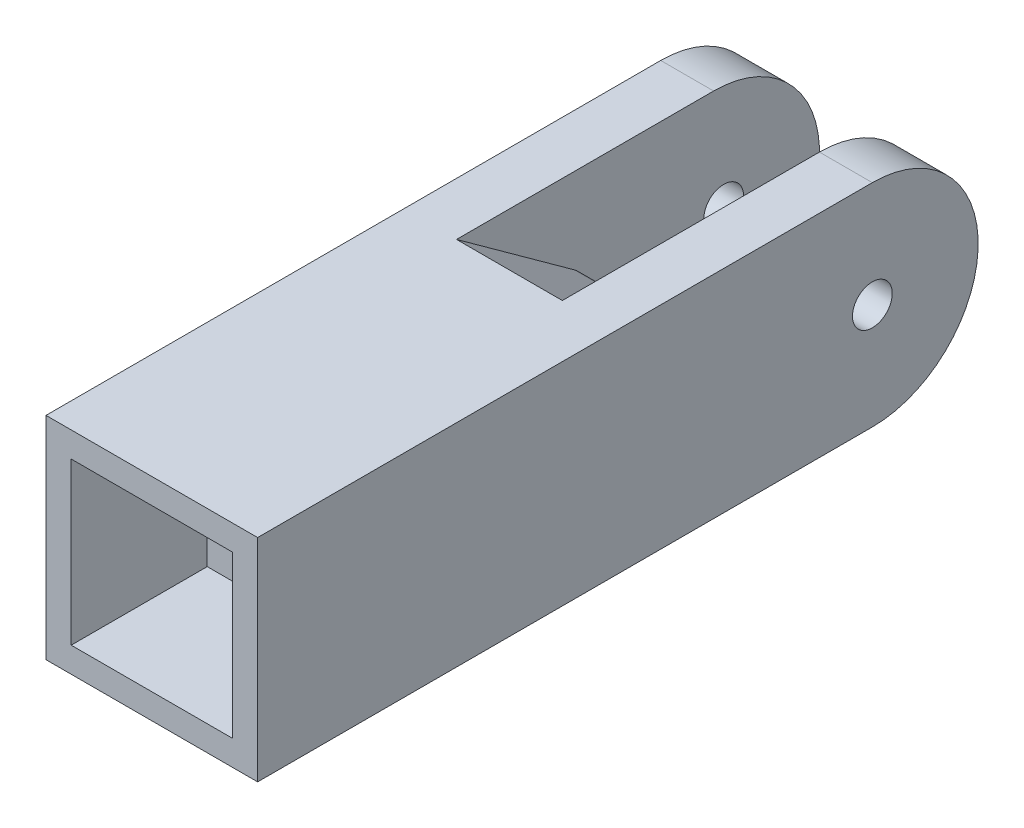
ISO-10303-21;
HEADER;
FILE_DESCRIPTION(('STEP AP214'),'2;1');
FILE_NAME('part.step','',(''),(''),'','','');
FILE_SCHEMA(('AUTOMOTIVE_DESIGN { 1 0 10303 214 1 1 1 1 }'));
ENDSEC;
DATA;
#1=APPLICATION_CONTEXT('core data for automotive mechanical design processes');
#2=APPLICATION_PROTOCOL_DEFINITION('international standard','automotive_design',2000,#1);
#3=PRODUCT_CONTEXT('',#1,'mechanical');
#4=PRODUCT('Part','Part','',(#3));
#5=PRODUCT_RELATED_PRODUCT_CATEGORY('part','',(#4));
#6=PRODUCT_DEFINITION_FORMATION('','',#4);
#7=PRODUCT_DEFINITION_CONTEXT('part definition',#1,'design');
#8=PRODUCT_DEFINITION('design','',#6,#7);
#9=PRODUCT_DEFINITION_SHAPE('','',#8);
#10=(LENGTH_UNIT() NAMED_UNIT(*) SI_UNIT(.MILLI.,.METRE.));
#11=(NAMED_UNIT(*) PLANE_ANGLE_UNIT() SI_UNIT($,.RADIAN.));
#12=(NAMED_UNIT(*) SI_UNIT($,.STERADIAN.) SOLID_ANGLE_UNIT());
#13=UNCERTAINTY_MEASURE_WITH_UNIT(LENGTH_MEASURE(1.E-05),#10,'distance_accuracy_value','');
#14=(GEOMETRIC_REPRESENTATION_CONTEXT(3) GLOBAL_UNCERTAINTY_ASSIGNED_CONTEXT((#13)) GLOBAL_UNIT_ASSIGNED_CONTEXT((#10,
#11,#12)) REPRESENTATION_CONTEXT('',''));
#15=CARTESIAN_POINT('',(0.,0.,0.));
#16=DIRECTION('',(0.,0.,1.));
#17=DIRECTION('',(1.,0.,0.));
#18=AXIS2_PLACEMENT_3D('',#15,#16,#17);
#19=CARTESIAN_POINT('',(21.,21.,100.));
#20=DIRECTION('',(-1.,0.,0.));
#21=DIRECTION('',(0.,-1.,0.));
#22=AXIS2_PLACEMENT_3D('',#19,#20,#21);
#23=PLANE('',#22);
#24=CARTESIAN_POINT('',(21.,0.,-22.));
#25=DIRECTION('',(-1.,0.,0.));
#26=DIRECTION('',(0.,0.,1.));
#27=AXIS2_PLACEMENT_3D('',#24,#25,#26);
#28=CIRCLE('',#27,3.95);
#29=CARTESIAN_POINT('',(21.,0.,-18.05));
#30=VERTEX_POINT('',#29);
#31=EDGE_CURVE('E206',#30,#30,#28,.T.);
#32=ORIENTED_EDGE('',*,*,#31,.T.);
#33=EDGE_LOOP('',(#32));
#34=FACE_BOUND('',#33,.T.);
#35=DIRECTION('',(0.,0.,-1.));
#36=VECTOR('',#35,1.);
#37=CARTESIAN_POINT('',(21.,-21.,100.));
#38=LINE('',#37,#36);
#39=CARTESIAN_POINT('',(21.,-21.,100.));
#40=VERTEX_POINT('',#39);
#41=CARTESIAN_POINT('',(21.,-21.,-22.));
#42=VERTEX_POINT('',#41);
#43=EDGE_CURVE('E308',#40,#42,#38,.T.);
#44=ORIENTED_EDGE('',*,*,#43,.T.);
#45=CARTESIAN_POINT('',(21.,0.,-22.));
#46=DIRECTION('',(1.,0.,0.));
#47=DIRECTION('',(0.,-1.,0.));
#48=AXIS2_PLACEMENT_3D('',#45,#46,#47);
#49=CIRCLE('',#48,21.);
#50=CARTESIAN_POINT('',(21.,21.,-22.));
#51=VERTEX_POINT('',#50);
#52=EDGE_CURVE('E248',#42,#51,#49,.T.);
#53=ORIENTED_EDGE('',*,*,#52,.T.);
#54=DIRECTION('',(0.,0.,-1.));
#55=VECTOR('',#54,1.);
#56=CARTESIAN_POINT('',(21.,21.,100.));
#57=LINE('',#56,#55);
#58=CARTESIAN_POINT('',(21.,21.,100.));
#59=VERTEX_POINT('',#58);
#60=EDGE_CURVE('E319',#59,#51,#57,.T.);
#61=ORIENTED_EDGE('',*,*,#60,.F.);
#62=DIRECTION('',(0.,1.,0.));
#63=VECTOR('',#62,1.);
#64=CARTESIAN_POINT('',(21.,21.,100.));
#65=LINE('',#64,#63);
#66=EDGE_CURVE('E295',#40,#59,#65,.T.);
#67=ORIENTED_EDGE('',*,*,#66,.F.);
#68=EDGE_LOOP('',(#44,#53,#61,#67));
#69=FACE_BOUND('',#68,.T.);
#70=ADVANCED_FACE('F57',(#34,#69),#23,.F.);
#71=CARTESIAN_POINT('',(-21.,21.,100.));
#72=DIRECTION('',(0.,-1.,0.));
#73=DIRECTION('',(0.,0.,-1.));
#74=AXIS2_PLACEMENT_3D('',#71,#72,#73);
#75=PLANE('',#74);
#76=DIRECTION('',(1.,0.,0.));
#77=VECTOR('',#76,1.);
#78=CARTESIAN_POINT('',(-10.5,21.,29.0251989154413));
#79=LINE('',#78,#77);
#80=CARTESIAN_POINT('',(-10.5,21.,29.0251989154413));
#81=VERTEX_POINT('',#80);
#82=CARTESIAN_POINT('',(10.5,21.,29.0251989154413));
#83=VERTEX_POINT('',#82);
#84=EDGE_CURVE('E192',#81,#83,#79,.T.);
#85=ORIENTED_EDGE('',*,*,#84,.F.);
#86=DIRECTION('',(0.,0.,1.));
#87=VECTOR('',#86,1.);
#88=CARTESIAN_POINT('',(-10.5,21.,-22.));
#89=LINE('',#88,#87);
#90=CARTESIAN_POINT('',(-10.5,21.,-22.));
#91=VERTEX_POINT('',#90);
#92=EDGE_CURVE('E168',#91,#81,#89,.T.);
#93=ORIENTED_EDGE('',*,*,#92,.F.);
#94=DIRECTION('',(1.,0.,0.));
#95=VECTOR('',#94,1.);
#96=CARTESIAN_POINT('',(-21.,21.,-22.));
#97=LINE('',#96,#95);
#98=CARTESIAN_POINT('',(-21.,21.,-22.));
#99=VERTEX_POINT('',#98);
#100=EDGE_CURVE('E287',#99,#91,#97,.T.);
#101=ORIENTED_EDGE('',*,*,#100,.F.);
#102=DIRECTION('',(0.,0.,-1.));
#103=VECTOR('',#102,1.);
#104=CARTESIAN_POINT('',(-21.,21.,100.));
#105=LINE('',#104,#103);
#106=CARTESIAN_POINT('',(-21.,21.,100.));
#107=VERTEX_POINT('',#106);
#108=EDGE_CURVE('E315',#107,#99,#105,.T.);
#109=ORIENTED_EDGE('',*,*,#108,.F.);
#110=DIRECTION('',(-1.,0.,0.));
#111=VECTOR('',#110,1.);
#112=CARTESIAN_POINT('',(-21.,21.,100.));
#113=LINE('',#112,#111);
#114=EDGE_CURVE('E299',#59,#107,#113,.T.);
#115=ORIENTED_EDGE('',*,*,#114,.F.);
#116=ORIENTED_EDGE('',*,*,#60,.T.);
#117=DIRECTION('',(1.,0.,0.));
#118=VECTOR('',#117,1.);
#119=CARTESIAN_POINT('',(21.,21.,-22.));
#120=LINE('',#119,#118);
#121=CARTESIAN_POINT('',(10.5,21.,-22.));
#122=VERTEX_POINT('',#121);
#123=EDGE_CURVE('E276',#122,#51,#120,.T.);
#124=ORIENTED_EDGE('',*,*,#123,.F.);
#125=DIRECTION('',(0.,0.,1.));
#126=VECTOR('',#125,1.);
#127=CARTESIAN_POINT('',(10.5,21.,-22.));
#128=LINE('',#127,#126);
#129=EDGE_CURVE('E280',#122,#83,#128,.T.);
#130=ORIENTED_EDGE('',*,*,#129,.T.);
#131=EDGE_LOOP('',(#85,#93,#101,#109,#115,#116,#124,#130));
#132=FACE_BOUND('',#131,.T.);
#133=ADVANCED_FACE('F352',(#132),#75,.F.);
#134=CARTESIAN_POINT('',(-21.,21.,100.));
#135=DIRECTION('',(1.,0.,0.));
#136=DIRECTION('',(0.,1.,0.));
#137=AXIS2_PLACEMENT_3D('',#134,#135,#136);
#138=PLANE('',#137);
#139=CARTESIAN_POINT('',(-21.,0.,-24.));
#140=DIRECTION('',(1.,0.,0.));
#141=DIRECTION('',(0.,1.,0.));
#142=AXIS2_PLACEMENT_3D('',#139,#140,#141);
#143=CIRCLE('',#142,3.95);
#144=CARTESIAN_POINT('',(-21.,3.95,-24.));
#145=VERTEX_POINT('',#144);
#146=EDGE_CURVE('E198',#145,#145,#143,.T.);
#147=ORIENTED_EDGE('',*,*,#146,.T.);
#148=EDGE_LOOP('',(#147));
#149=FACE_BOUND('',#148,.T.);
#150=ORIENTED_EDGE('',*,*,#108,.T.);
#151=CARTESIAN_POINT('',(-21.,0.,-22.));
#152=DIRECTION('',(-1.,0.,0.));
#153=DIRECTION('',(0.,1.,0.));
#154=AXIS2_PLACEMENT_3D('',#151,#152,#153);
#155=CIRCLE('',#154,21.);
#156=CARTESIAN_POINT('',(-21.,-21.,-22.));
#157=VERTEX_POINT('',#156);
#158=EDGE_CURVE('E262',#99,#157,#155,.T.);
#159=ORIENTED_EDGE('',*,*,#158,.T.);
#160=DIRECTION('',(0.,0.,-1.));
#161=VECTOR('',#160,1.);
#162=CARTESIAN_POINT('',(-21.,-21.,100.));
#163=LINE('',#162,#161);
#164=CARTESIAN_POINT('',(-21.,-21.,100.));
#165=VERTEX_POINT('',#164);
#166=EDGE_CURVE('E312',#165,#157,#163,.T.);
#167=ORIENTED_EDGE('',*,*,#166,.F.);
#168=DIRECTION('',(0.,-1.,0.));
#169=VECTOR('',#168,1.);
#170=CARTESIAN_POINT('',(-21.,21.,100.));
#171=LINE('',#170,#169);
#172=EDGE_CURVE('E302',#107,#165,#171,.T.);
#173=ORIENTED_EDGE('',*,*,#172,.F.);
#174=EDGE_LOOP('',(#150,#159,#167,#173));
#175=FACE_BOUND('',#174,.T.);
#176=ADVANCED_FACE('F346',(#149,#175),#138,.F.);
#177=CARTESIAN_POINT('',(-21.,-21.,100.));
#178=DIRECTION('',(0.,1.,0.));
#179=DIRECTION('',(0.,0.,1.));
#180=AXIS2_PLACEMENT_3D('',#177,#178,#179);
#181=PLANE('',#180);
#182=DIRECTION('',(0.,0.,1.));
#183=VECTOR('',#182,1.);
#184=CARTESIAN_POINT('',(-10.5,-21.,-22.));
#185=LINE('',#184,#183);
#186=CARTESIAN_POINT('',(-10.5,-21.,-22.));
#187=VERTEX_POINT('',#186);
#188=CARTESIAN_POINT('',(-10.5,-21.,29.0251989154413));
#189=VERTEX_POINT('',#188);
#190=EDGE_CURVE('E157',#187,#189,#185,.T.);
#191=ORIENTED_EDGE('',*,*,#190,.T.);
#192=DIRECTION('',(1.,0.,0.));
#193=VECTOR('',#192,1.);
#194=CARTESIAN_POINT('',(-10.5,-21.,29.0251989154413));
#195=LINE('',#194,#193);
#196=CARTESIAN_POINT('',(10.5,-21.,29.0251989154413));
#197=VERTEX_POINT('',#196);
#198=EDGE_CURVE('E161',#189,#197,#195,.T.);
#199=ORIENTED_EDGE('',*,*,#198,.T.);
#200=DIRECTION('',(0.,0.,1.));
#201=VECTOR('',#200,1.);
#202=CARTESIAN_POINT('',(10.5,-21.,-22.));
#203=LINE('',#202,#201);
#204=CARTESIAN_POINT('',(10.5,-21.,-22.));
#205=VERTEX_POINT('',#204);
#206=EDGE_CURVE('E284',#205,#197,#203,.T.);
#207=ORIENTED_EDGE('',*,*,#206,.F.);
#208=DIRECTION('',(-1.,0.,0.));
#209=VECTOR('',#208,1.);
#210=CARTESIAN_POINT('',(21.,-21.,-22.));
#211=LINE('',#210,#209);
#212=EDGE_CURVE('E269',#42,#205,#211,.T.);
#213=ORIENTED_EDGE('',*,*,#212,.F.);
#214=ORIENTED_EDGE('',*,*,#43,.F.);
#215=DIRECTION('',(1.,0.,0.));
#216=VECTOR('',#215,1.);
#217=CARTESIAN_POINT('',(-21.,-21.,100.));
#218=LINE('',#217,#216);
#219=EDGE_CURVE('E305',#165,#40,#218,.T.);
#220=ORIENTED_EDGE('',*,*,#219,.F.);
#221=ORIENTED_EDGE('',*,*,#166,.T.);
#222=DIRECTION('',(-1.,0.,0.));
#223=VECTOR('',#222,1.);
#224=CARTESIAN_POINT('',(-21.,-21.,-22.));
#225=LINE('',#224,#223);
#226=EDGE_CURVE('E163',#187,#157,#225,.T.);
#227=ORIENTED_EDGE('',*,*,#226,.F.);
#228=EDGE_LOOP('',(#191,#199,#207,#213,#214,#220,#221,#227));
#229=FACE_BOUND('',#228,.T.);
#230=ADVANCED_FACE('F159',(#229),#181,.F.);
#231=CARTESIAN_POINT('',(0.,0.,100.));
#232=DIRECTION('',(0.,0.,1.));
#233=DIRECTION('',(1.,0.,0.));
#234=AXIS2_PLACEMENT_3D('',#231,#232,#233);
#235=PLANE('',#234);
#236=DIRECTION('',(0.,1.,0.));
#237=VECTOR('',#236,1.);
#238=CARTESIAN_POINT('',(16.,16.,100.));
#239=LINE('',#238,#237);
#240=CARTESIAN_POINT('',(16.,-16.,100.));
#241=VERTEX_POINT('',#240);
#242=CARTESIAN_POINT('',(16.,16.,100.));
#243=VERTEX_POINT('',#242);
#244=EDGE_CURVE('E210',#241,#243,#239,.T.);
#245=ORIENTED_EDGE('',*,*,#244,.F.);
#246=DIRECTION('',(1.,0.,0.));
#247=VECTOR('',#246,1.);
#248=CARTESIAN_POINT('',(-16.,-16.,100.));
#249=LINE('',#248,#247);
#250=CARTESIAN_POINT('',(-16.,-16.,100.));
#251=VERTEX_POINT('',#250);
#252=EDGE_CURVE('E219',#251,#241,#249,.T.);
#253=ORIENTED_EDGE('',*,*,#252,.F.);
#254=DIRECTION('',(0.,-1.,0.));
#255=VECTOR('',#254,1.);
#256=CARTESIAN_POINT('',(-16.,16.,100.));
#257=LINE('',#256,#255);
#258=CARTESIAN_POINT('',(-16.,16.,100.));
#259=VERTEX_POINT('',#258);
#260=EDGE_CURVE('E238',#259,#251,#257,.T.);
#261=ORIENTED_EDGE('',*,*,#260,.F.);
#262=DIRECTION('',(-1.,0.,0.));
#263=VECTOR('',#262,1.);
#264=CARTESIAN_POINT('',(-16.,16.,100.));
#265=LINE('',#264,#263);
#266=EDGE_CURVE('E234',#243,#259,#265,.T.);
#267=ORIENTED_EDGE('',*,*,#266,.F.);
#268=EDGE_LOOP('',(#245,#253,#261,#267));
#269=FACE_BOUND('',#268,.T.);
#270=ORIENTED_EDGE('',*,*,#66,.T.);
#271=ORIENTED_EDGE('',*,*,#114,.T.);
#272=ORIENTED_EDGE('',*,*,#172,.T.);
#273=ORIENTED_EDGE('',*,*,#219,.T.);
#274=EDGE_LOOP('',(#270,#271,#272,#273));
#275=FACE_BOUND('',#274,.T.);
#276=ADVANCED_FACE('F342',(#269,#275),#235,.T.);
#277=CARTESIAN_POINT('',(-10.5,-21.,-22.));
#278=DIRECTION('',(-1.,0.,0.));
#279=DIRECTION('',(0.,-1.,0.));
#280=AXIS2_PLACEMENT_3D('',#277,#278,#279);
#281=PLANE('',#280);
#282=CARTESIAN_POINT('',(-10.5,0.,-24.));
#283=DIRECTION('',(1.,0.,0.));
#284=DIRECTION('',(0.,1.,0.));
#285=AXIS2_PLACEMENT_3D('',#282,#283,#284);
#286=CIRCLE('',#285,3.95);
#287=CARTESIAN_POINT('',(-10.5,3.95,-24.));
#288=VERTEX_POINT('',#287);
#289=EDGE_CURVE('E197',#288,#288,#286,.T.);
#290=ORIENTED_EDGE('',*,*,#289,.F.);
#291=EDGE_LOOP('',(#290));
#292=FACE_BOUND('',#291,.T.);
#293=ORIENTED_EDGE('',*,*,#92,.T.);
#294=DIRECTION('',(0.,0.586175629081479,0.810184011117804));
#295=VECTOR('',#294,1.);
#296=CARTESIAN_POINT('',(-10.5,0.,0.));
#297=LINE('',#296,#295);
#298=CARTESIAN_POINT('',(-10.5,4.05092005558902,5.59898859066771));
#299=VERTEX_POINT('',#298);
#300=EDGE_CURVE('E187',#299,#81,#297,.T.);
#301=ORIENTED_EDGE('',*,*,#300,.F.);
#302=CARTESIAN_POINT('',(-10.5,0.,8.5298667360751));
#303=DIRECTION('',(-1.,0.,0.));
#304=DIRECTION('',(0.,-1.,0.));
#305=AXIS2_PLACEMENT_3D('',#302,#303,#304);
#306=CIRCLE('',#305,5.);
#307=CARTESIAN_POINT('',(-10.5,-4.05092005558902,5.59898859066771));
#308=VERTEX_POINT('',#307);
#309=EDGE_CURVE('E12',#299,#308,#306,.T.);
#310=ORIENTED_EDGE('',*,*,#309,.T.);
#311=DIRECTION('',(0.,0.586175629081479,-0.810184011117803));
#312=VECTOR('',#311,1.);
#313=CARTESIAN_POINT('',(-10.5,0.,0.));
#314=LINE('',#313,#312);
#315=EDGE_CURVE('E171',#189,#308,#314,.T.);
#316=ORIENTED_EDGE('',*,*,#315,.F.);
#317=ORIENTED_EDGE('',*,*,#190,.F.);
#318=CARTESIAN_POINT('',(-10.5,0.,-22.));
#319=DIRECTION('',(-1.,0.,0.));
#320=DIRECTION('',(0.,1.,0.));
#321=AXIS2_PLACEMENT_3D('',#318,#319,#320);
#322=CIRCLE('',#321,21.);
#323=EDGE_CURVE('E266',#91,#187,#322,.T.);
#324=ORIENTED_EDGE('',*,*,#323,.F.);
#325=EDGE_LOOP('',(#293,#301,#310,#316,#317,#324));
#326=FACE_BOUND('',#325,.T.);
#327=ADVANCED_FACE('F173',(#292,#326),#281,.F.);
#328=CARTESIAN_POINT('',(10.5,-21.,-22.));
#329=DIRECTION('',(1.,0.,0.));
#330=DIRECTION('',(0.,0.,-1.));
#331=AXIS2_PLACEMENT_3D('',#328,#329,#330);
#332=PLANE('',#331);
#333=CARTESIAN_POINT('',(10.5,0.,-22.));
#334=DIRECTION('',(-1.,0.,0.));
#335=DIRECTION('',(0.,0.,1.));
#336=AXIS2_PLACEMENT_3D('',#333,#334,#335);
#337=CIRCLE('',#336,3.95);
#338=CARTESIAN_POINT('',(10.5,0.,-18.05));
#339=VERTEX_POINT('',#338);
#340=EDGE_CURVE('E202',#339,#339,#337,.T.);
#341=ORIENTED_EDGE('',*,*,#340,.F.);
#342=EDGE_LOOP('',(#341));
#343=FACE_BOUND('',#342,.T.);
#344=ORIENTED_EDGE('',*,*,#206,.T.);
#345=DIRECTION('',(0.,0.586175629081479,-0.810184011117803));
#346=VECTOR('',#345,1.);
#347=CARTESIAN_POINT('',(10.5,0.,0.));
#348=LINE('',#347,#346);
#349=CARTESIAN_POINT('',(10.5,-4.05092005558902,5.59898859066771));
#350=VERTEX_POINT('',#349);
#351=EDGE_CURVE('E179',#197,#350,#348,.T.);
#352=ORIENTED_EDGE('',*,*,#351,.T.);
#353=CARTESIAN_POINT('',(10.5,0.,8.5298667360751));
#354=DIRECTION('',(1.,0.,0.));
#355=DIRECTION('',(0.,0.,-1.));
#356=AXIS2_PLACEMENT_3D('',#353,#354,#355);
#357=CIRCLE('',#356,5.);
#358=CARTESIAN_POINT('',(10.5,4.05092005558902,5.59898859066771));
#359=VERTEX_POINT('',#358);
#360=EDGE_CURVE('E66',#350,#359,#357,.T.);
#361=ORIENTED_EDGE('',*,*,#360,.T.);
#362=DIRECTION('',(0.,0.586175629081479,0.810184011117804));
#363=VECTOR('',#362,1.);
#364=CARTESIAN_POINT('',(10.5,0.,0.));
#365=LINE('',#364,#363);
#366=EDGE_CURVE('E184',#359,#83,#365,.T.);
#367=ORIENTED_EDGE('',*,*,#366,.T.);
#368=ORIENTED_EDGE('',*,*,#129,.F.);
#369=CARTESIAN_POINT('',(10.5,0.,-22.));
#370=DIRECTION('',(1.,0.,0.));
#371=DIRECTION('',(0.,-1.,0.));
#372=AXIS2_PLACEMENT_3D('',#369,#370,#371);
#373=CIRCLE('',#372,21.);
#374=EDGE_CURVE('E258',#205,#122,#373,.T.);
#375=ORIENTED_EDGE('',*,*,#374,.F.);
#376=EDGE_LOOP('',(#344,#352,#361,#367,#368,#375));
#377=FACE_BOUND('',#376,.T.);
#378=ADVANCED_FACE('F328',(#343,#377),#332,.F.);
#379=CARTESIAN_POINT('',(-10.5,0.,-22.));
#380=DIRECTION('',(-1.,0.,0.));
#381=DIRECTION('',(0.,-1.,0.));
#382=AXIS2_PLACEMENT_3D('',#379,#380,#381);
#383=CYLINDRICAL_SURFACE('',#382,21.);
#384=ORIENTED_EDGE('',*,*,#158,.F.);
#385=ORIENTED_EDGE('',*,*,#100,.T.);
#386=ORIENTED_EDGE('',*,*,#323,.T.);
#387=ORIENTED_EDGE('',*,*,#226,.T.);
#388=EDGE_LOOP('',(#384,#385,#386,#387));
#389=FACE_BOUND('',#388,.T.);
#390=ADVANCED_FACE('F349',(#389),#383,.T.);
#391=CARTESIAN_POINT('',(10.5,0.,-22.));
#392=DIRECTION('',(1.,0.,0.));
#393=DIRECTION('',(0.,1.,0.));
#394=AXIS2_PLACEMENT_3D('',#391,#392,#393);
#395=CYLINDRICAL_SURFACE('',#394,21.);
#396=ORIENTED_EDGE('',*,*,#52,.F.);
#397=ORIENTED_EDGE('',*,*,#212,.T.);
#398=ORIENTED_EDGE('',*,*,#374,.T.);
#399=ORIENTED_EDGE('',*,*,#123,.T.);
#400=EDGE_LOOP('',(#396,#397,#398,#399));
#401=FACE_BOUND('',#400,.T.);
#402=ADVANCED_FACE('F334',(#401),#395,.T.);
#403=CARTESIAN_POINT('',(16.,16.,73.));
#404=DIRECTION('',(1.,0.,0.));
#405=DIRECTION('',(0.,0.,-1.));
#406=AXIS2_PLACEMENT_3D('',#403,#404,#405);
#407=PLANE('',#406);
#408=ORIENTED_EDGE('',*,*,#244,.T.);
#409=DIRECTION('',(0.,0.,1.));
#410=VECTOR('',#409,1.);
#411=CARTESIAN_POINT('',(16.,16.,73.));
#412=LINE('',#411,#410);
#413=CARTESIAN_POINT('',(16.,16.,73.));
#414=VERTEX_POINT('',#413);
#415=EDGE_CURVE('E231',#414,#243,#412,.T.);
#416=ORIENTED_EDGE('',*,*,#415,.F.);
#417=DIRECTION('',(0.,1.,0.));
#418=VECTOR('',#417,1.);
#419=CARTESIAN_POINT('',(16.,16.,73.));
#420=LINE('',#419,#418);
#421=CARTESIAN_POINT('',(16.,-16.,73.));
#422=VERTEX_POINT('',#421);
#423=EDGE_CURVE('E214',#422,#414,#420,.T.);
#424=ORIENTED_EDGE('',*,*,#423,.F.);
#425=DIRECTION('',(0.,0.,1.));
#426=VECTOR('',#425,1.);
#427=CARTESIAN_POINT('',(16.,-16.,73.));
#428=LINE('',#427,#426);
#429=EDGE_CURVE('E245',#422,#241,#428,.T.);
#430=ORIENTED_EDGE('',*,*,#429,.T.);
#431=EDGE_LOOP('',(#408,#416,#424,#430));
#432=FACE_BOUND('',#431,.T.);
#433=ADVANCED_FACE('F384',(#432),#407,.F.);
#434=CARTESIAN_POINT('',(-16.,-16.,73.));
#435=DIRECTION('',(0.,-1.,0.));
#436=DIRECTION('',(0.,0.,-1.));
#437=AXIS2_PLACEMENT_3D('',#434,#435,#436);
#438=PLANE('',#437);
#439=ORIENTED_EDGE('',*,*,#252,.T.);
#440=ORIENTED_EDGE('',*,*,#429,.F.);
#441=DIRECTION('',(1.,0.,0.));
#442=VECTOR('',#441,1.);
#443=CARTESIAN_POINT('',(-16.,-16.,73.));
#444=LINE('',#443,#442);
#445=CARTESIAN_POINT('',(-16.,-16.,73.));
#446=VERTEX_POINT('',#445);
#447=EDGE_CURVE('E227',#446,#422,#444,.T.);
#448=ORIENTED_EDGE('',*,*,#447,.F.);
#449=DIRECTION('',(0.,0.,1.));
#450=VECTOR('',#449,1.);
#451=CARTESIAN_POINT('',(-16.,-16.,73.));
#452=LINE('',#451,#450);
#453=EDGE_CURVE('E249',#446,#251,#452,.T.);
#454=ORIENTED_EDGE('',*,*,#453,.T.);
#455=EDGE_LOOP('',(#439,#440,#448,#454));
#456=FACE_BOUND('',#455,.T.);
#457=ADVANCED_FACE('F387',(#456),#438,.F.);
#458=CARTESIAN_POINT('',(-16.,16.,73.));
#459=DIRECTION('',(-1.,0.,0.));
#460=DIRECTION('',(0.,0.,1.));
#461=AXIS2_PLACEMENT_3D('',#458,#459,#460);
#462=PLANE('',#461);
#463=ORIENTED_EDGE('',*,*,#260,.T.);
#464=ORIENTED_EDGE('',*,*,#453,.F.);
#465=DIRECTION('',(0.,-1.,0.));
#466=VECTOR('',#465,1.);
#467=CARTESIAN_POINT('',(-16.,16.,73.));
#468=LINE('',#467,#466);
#469=CARTESIAN_POINT('',(-16.,16.,73.));
#470=VERTEX_POINT('',#469);
#471=EDGE_CURVE('E223',#470,#446,#468,.T.);
#472=ORIENTED_EDGE('',*,*,#471,.F.);
#473=DIRECTION('',(0.,0.,1.));
#474=VECTOR('',#473,1.);
#475=CARTESIAN_POINT('',(-16.,16.,73.));
#476=LINE('',#475,#474);
#477=EDGE_CURVE('E252',#470,#259,#476,.T.);
#478=ORIENTED_EDGE('',*,*,#477,.T.);
#479=EDGE_LOOP('',(#463,#464,#472,#478));
#480=FACE_BOUND('',#479,.T.);
#481=ADVANCED_FACE('F393',(#480),#462,.F.);
#482=CARTESIAN_POINT('',(-16.,16.,73.));
#483=DIRECTION('',(0.,1.,0.));
#484=DIRECTION('',(0.,0.,1.));
#485=AXIS2_PLACEMENT_3D('',#482,#483,#484);
#486=PLANE('',#485);
#487=ORIENTED_EDGE('',*,*,#266,.T.);
#488=ORIENTED_EDGE('',*,*,#477,.F.);
#489=DIRECTION('',(-1.,0.,0.));
#490=VECTOR('',#489,1.);
#491=CARTESIAN_POINT('',(-16.,16.,73.));
#492=LINE('',#491,#490);
#493=EDGE_CURVE('E218',#414,#470,#492,.T.);
#494=ORIENTED_EDGE('',*,*,#493,.F.);
#495=ORIENTED_EDGE('',*,*,#415,.T.);
#496=EDGE_LOOP('',(#487,#488,#494,#495));
#497=FACE_BOUND('',#496,.T.);
#498=ADVANCED_FACE('F389',(#497),#486,.F.);
#499=CARTESIAN_POINT('',(0.,0.,73.));
#500=DIRECTION('',(0.,0.,1.));
#501=DIRECTION('',(1.,0.,0.));
#502=AXIS2_PLACEMENT_3D('',#499,#500,#501);
#503=PLANE('',#502);
#504=ORIENTED_EDGE('',*,*,#423,.T.);
#505=ORIENTED_EDGE('',*,*,#493,.T.);
#506=ORIENTED_EDGE('',*,*,#471,.T.);
#507=ORIENTED_EDGE('',*,*,#447,.T.);
#508=EDGE_LOOP('',(#504,#505,#506,#507));
#509=FACE_BOUND('',#508,.T.);
#510=ADVANCED_FACE('F392',(#509),#503,.T.);
#511=CARTESIAN_POINT('',(21.,0.,-22.));
#512=DIRECTION('',(-1.,0.,0.));
#513=DIRECTION('',(0.,0.,1.));
#514=AXIS2_PLACEMENT_3D('',#511,#512,#513);
#515=CYLINDRICAL_SURFACE('',#514,3.95);
#516=CARTESIAN_POINT('',(21.,0.,-18.05));
#517=CARTESIAN_POINT('',(20.890625,0.,-18.05));
#518=CARTESIAN_POINT('',(20.78125,0.,-18.05));
#519=CARTESIAN_POINT('',(20.5625,0.,-18.05));
#520=CARTESIAN_POINT('',(20.453125,0.,-18.05));
#521=CARTESIAN_POINT('',(20.234375,0.,-18.05));
#522=CARTESIAN_POINT('',(20.125,0.,-18.05));
#523=CARTESIAN_POINT('',(19.90625,0.,-18.05));
#524=CARTESIAN_POINT('',(19.796875,0.,-18.05));
#525=CARTESIAN_POINT('',(19.578125,0.,-18.05));
#526=CARTESIAN_POINT('',(19.46875,0.,-18.05));
#527=CARTESIAN_POINT('',(19.25,0.,-18.05));
#528=CARTESIAN_POINT('',(19.140625,0.,-18.05));
#529=CARTESIAN_POINT('',(18.921875,0.,-18.05));
#530=CARTESIAN_POINT('',(18.8125,0.,-18.05));
#531=CARTESIAN_POINT('',(18.59375,0.,-18.05));
#532=CARTESIAN_POINT('',(18.484375,0.,-18.05));
#533=CARTESIAN_POINT('',(18.265625,0.,-18.05));
#534=CARTESIAN_POINT('',(18.15625,0.,-18.05));
#535=CARTESIAN_POINT('',(17.9375,0.,-18.05));
#536=CARTESIAN_POINT('',(17.828125,0.,-18.05));
#537=CARTESIAN_POINT('',(17.609375,0.,-18.05));
#538=CARTESIAN_POINT('',(17.5,0.,-18.05));
#539=CARTESIAN_POINT('',(17.28125,0.,-18.05));
#540=CARTESIAN_POINT('',(17.171875,0.,-18.05));
#541=CARTESIAN_POINT('',(16.953125,0.,-18.05));
#542=CARTESIAN_POINT('',(16.84375,0.,-18.05));
#543=CARTESIAN_POINT('',(16.625,0.,-18.05));
#544=CARTESIAN_POINT('',(16.515625,0.,-18.05));
#545=CARTESIAN_POINT('',(16.296875,0.,-18.05));
#546=CARTESIAN_POINT('',(16.1875,0.,-18.05));
#547=CARTESIAN_POINT('',(15.96875,0.,-18.05));
#548=CARTESIAN_POINT('',(15.859375,0.,-18.05));
#549=CARTESIAN_POINT('',(15.640625,0.,-18.05));
#550=CARTESIAN_POINT('',(15.53125,0.,-18.05));
#551=CARTESIAN_POINT('',(15.3125,0.,-18.05));
#552=CARTESIAN_POINT('',(15.203125,0.,-18.05));
#553=CARTESIAN_POINT('',(14.984375,0.,-18.05));
#554=CARTESIAN_POINT('',(14.875,0.,-18.05));
#555=CARTESIAN_POINT('',(14.65625,0.,-18.05));
#556=CARTESIAN_POINT('',(14.546875,0.,-18.05));
#557=CARTESIAN_POINT('',(14.328125,0.,-18.05));
#558=CARTESIAN_POINT('',(14.21875,0.,-18.05));
#559=CARTESIAN_POINT('',(14.,0.,-18.05));
#560=CARTESIAN_POINT('',(13.890625,0.,-18.05));
#561=CARTESIAN_POINT('',(13.671875,0.,-18.05));
#562=CARTESIAN_POINT('',(13.5625,0.,-18.05));
#563=CARTESIAN_POINT('',(13.34375,0.,-18.05));
#564=CARTESIAN_POINT('',(13.234375,0.,-18.05));
#565=CARTESIAN_POINT('',(13.015625,0.,-18.05));
#566=CARTESIAN_POINT('',(12.90625,0.,-18.05));
#567=CARTESIAN_POINT('',(12.6875,0.,-18.05));
#568=CARTESIAN_POINT('',(12.578125,0.,-18.05));
#569=CARTESIAN_POINT('',(12.359375,0.,-18.05));
#570=CARTESIAN_POINT('',(12.25,0.,-18.05));
#571=CARTESIAN_POINT('',(12.03125,0.,-18.05));
#572=CARTESIAN_POINT('',(11.921875,0.,-18.05));
#573=CARTESIAN_POINT('',(11.703125,0.,-18.05));
#574=CARTESIAN_POINT('',(11.59375,0.,-18.05));
#575=CARTESIAN_POINT('',(11.375,0.,-18.05));
#576=CARTESIAN_POINT('',(11.265625,0.,-18.05));
#577=CARTESIAN_POINT('',(11.046875,0.,-18.05));
#578=CARTESIAN_POINT('',(10.9375,0.,-18.05));
#579=CARTESIAN_POINT('',(10.71875,0.,-18.05));
#580=CARTESIAN_POINT('',(10.609375,0.,-18.05));
#581=CARTESIAN_POINT('',(10.5,0.,-18.05));
#582=B_SPLINE_CURVE_WITH_KNOTS('',3,(#516,#517,#518,#519,#520,#521,#522,#523,#524,#525,#526,
#527,#528,#529,#530,#531,#532,#533,#534,#535,#536,#537,#538,#539,#540,#541,#542,#543,#544,#545,
#546,#547,#548,#549,#550,#551,#552,#553,#554,#555,#556,#557,#558,#559,#560,#561,#562,#563,#564,
#565,#566,#567,#568,#569,#570,#571,#572,#573,#574,#575,#576,#577,#578,#579,#580,#581),
.UNSPECIFIED.,.F.,.F.,(4,2,2,2,2,2,2,2,2,2,2,2,2,2,2,2,2,2,2,2,2,2,2,2,2,2,2,2,2,2,2,2,4),(0.,
0.328124999999999,0.656249999999997,0.984374999999999,1.3125,1.640625,1.96875,2.296875,2.625,
2.953125,3.28125,3.609375,3.9375,4.265625,4.59375,4.921875,5.25,5.578125,5.90625,6.234375,
6.5625,6.890625,7.21875,7.546875,7.875,8.203125,8.53125,8.859375,9.1875,9.515625,9.84375,
10.171875,10.5),.UNSPECIFIED.);
#583=EDGE_CURVE('BSEAM403',#30,#339,#582,.T.);
#584=ORIENTED_EDGE('',*,*,#31,.F.);
#585=ORIENTED_EDGE('',*,*,#340,.T.);
#586=ORIENTED_EDGE('',*,*,#583,.T.);
#587=ORIENTED_EDGE('',*,*,#583,.F.);
#588=EDGE_LOOP('',(#584,#586,#585,#587));
#589=FACE_BOUND('',#588,.T.);
#590=ADVANCED_FACE('F403',(#589),#515,.F.);
#591=CARTESIAN_POINT('',(-21.,0.,-24.));
#592=DIRECTION('',(1.,0.,0.));
#593=DIRECTION('',(0.,1.,0.));
#594=AXIS2_PLACEMENT_3D('',#591,#592,#593);
#595=CYLINDRICAL_SURFACE('',#594,3.95);
#596=ORIENTED_EDGE('',*,*,#146,.F.);
#597=EDGE_LOOP('',(#596));
#598=FACE_BOUND('',#597,.T.);
#599=ORIENTED_EDGE('',*,*,#289,.T.);
#600=EDGE_LOOP('',(#599));
#601=FACE_BOUND('',#600,.T.);
#602=ADVANCED_FACE('F407',(#598,#601),#595,.F.);
#603=CARTESIAN_POINT('',(-10.5,0.,0.));
#604=DIRECTION('',(0.,0.810184011117803,-0.586175629081478));
#605=DIRECTION('',(0.,0.586175629081479,0.810184011117804));
#606=AXIS2_PLACEMENT_3D('',#603,#604,#605);
#607=PLANE('',#606);
#608=ORIENTED_EDGE('',*,*,#366,.F.);
#609=DIRECTION('',(1.,0.,0.));
#610=VECTOR('',#609,1.);
#611=CARTESIAN_POINT('',(-10.5,4.05092005558901,5.59898859066771));
#612=LINE('',#611,#610);
#613=EDGE_CURVE('E73',#359,#299,#612,.F.);
#614=ORIENTED_EDGE('',*,*,#613,.T.);
#615=ORIENTED_EDGE('',*,*,#300,.T.);
#616=ORIENTED_EDGE('',*,*,#84,.T.);
#617=EDGE_LOOP('',(#608,#614,#615,#616));
#618=FACE_BOUND('',#617,.T.);
#619=ADVANCED_FACE('F353',(#618),#607,.T.);
#620=CARTESIAN_POINT('',(-10.5,0.,0.));
#621=DIRECTION('',(0.,-0.810184011117803,-0.586175629081479));
#622=DIRECTION('',(0.,0.586175629081479,-0.810184011117803));
#623=AXIS2_PLACEMENT_3D('',#620,#621,#622);
#624=PLANE('',#623);
#625=ORIENTED_EDGE('',*,*,#315,.T.);
#626=DIRECTION('',(1.,0.,0.));
#627=VECTOR('',#626,1.);
#628=CARTESIAN_POINT('',(-10.5,-4.05092005558902,5.59898859066771));
#629=LINE('',#628,#627);
#630=EDGE_CURVE('E322',#308,#350,#629,.T.);
#631=ORIENTED_EDGE('',*,*,#630,.T.);
#632=ORIENTED_EDGE('',*,*,#351,.F.);
#633=ORIENTED_EDGE('',*,*,#198,.F.);
#634=EDGE_LOOP('',(#625,#631,#632,#633));
#635=FACE_BOUND('',#634,.T.);
#636=ADVANCED_FACE('F182',(#635),#624,.T.);
#637=CARTESIAN_POINT('',(-10.5,0.,8.5298667360751));
#638=DIRECTION('',(1.,0.,0.));
#639=DIRECTION('',(0.,0.,-1.));
#640=AXIS2_PLACEMENT_3D('',#637,#638,#639);
#641=CYLINDRICAL_SURFACE('',#640,5.);
#642=ORIENTED_EDGE('',*,*,#309,.F.);
#643=ORIENTED_EDGE('',*,*,#613,.F.);
#644=ORIENTED_EDGE('',*,*,#360,.F.);
#645=ORIENTED_EDGE('',*,*,#630,.F.);
#646=EDGE_LOOP('',(#642,#643,#644,#645));
#647=FACE_BOUND('',#646,.T.);
#648=ADVANCED_FACE('F59',(#647),#641,.T.);
#649=CLOSED_SHELL('',(#70,#133,#176,#230,#276,#327,#378,#390,#402,#433,#457,#481,#498,#510,#590,
#602,#619,#636,#648));
#650=MANIFOLD_SOLID_BREP('B2',#649);
#651=ADVANCED_BREP_SHAPE_REPRESENTATION('',(#18,#650),#14);
#652=SHAPE_DEFINITION_REPRESENTATION(#9,#651);
ENDSEC;
END-ISO-10303-21;
